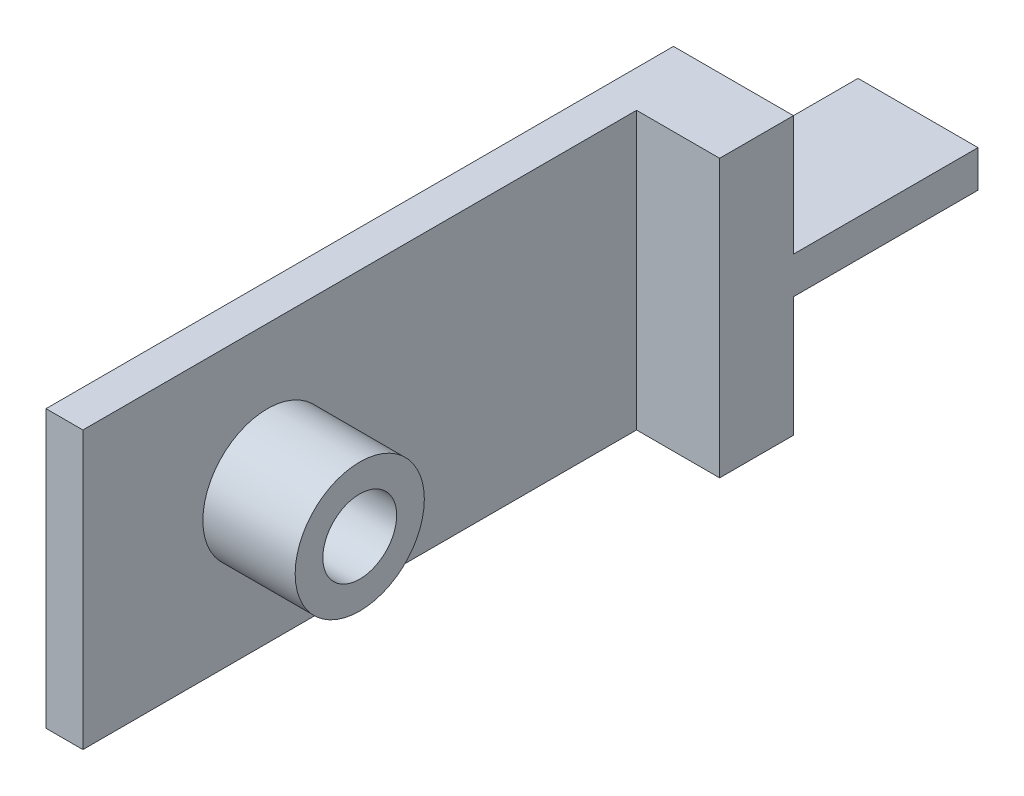
ISO-10303-21;
HEADER;
FILE_DESCRIPTION(('STEP AP214'),'2;1');
FILE_NAME('part.step','',(''),(''),'','','');
FILE_SCHEMA(('AUTOMOTIVE_DESIGN { 1 0 10303 214 1 1 1 1 }'));
ENDSEC;
DATA;
#1=APPLICATION_CONTEXT('core data for automotive mechanical design processes');
#2=APPLICATION_PROTOCOL_DEFINITION('international standard','automotive_design',2000,#1);
#3=PRODUCT_CONTEXT('',#1,'mechanical');
#4=PRODUCT('Part','Part','',(#3));
#5=PRODUCT_RELATED_PRODUCT_CATEGORY('part','',(#4));
#6=PRODUCT_DEFINITION_FORMATION('','',#4);
#7=PRODUCT_DEFINITION_CONTEXT('part definition',#1,'design');
#8=PRODUCT_DEFINITION('design','',#6,#7);
#9=PRODUCT_DEFINITION_SHAPE('','',#8);
#10=(LENGTH_UNIT() NAMED_UNIT(*) SI_UNIT(.MILLI.,.METRE.));
#11=(NAMED_UNIT(*) PLANE_ANGLE_UNIT() SI_UNIT($,.RADIAN.));
#12=(NAMED_UNIT(*) SI_UNIT($,.STERADIAN.) SOLID_ANGLE_UNIT());
#13=UNCERTAINTY_MEASURE_WITH_UNIT(LENGTH_MEASURE(1.E-05),#10,'distance_accuracy_value','');
#14=(GEOMETRIC_REPRESENTATION_CONTEXT(3) GLOBAL_UNCERTAINTY_ASSIGNED_CONTEXT((#13)) GLOBAL_UNIT_ASSIGNED_CONTEXT((#10,
#11,#12)) REPRESENTATION_CONTEXT('',''));
#15=CARTESIAN_POINT('',(0.,0.,0.));
#16=DIRECTION('',(0.,0.,1.));
#17=DIRECTION('',(1.,0.,0.));
#18=AXIS2_PLACEMENT_3D('',#15,#16,#17);
#19=CARTESIAN_POINT('',(0.,0.,-34.));
#20=DIRECTION('',(0.,0.,1.));
#21=DIRECTION('',(1.,0.,0.));
#22=AXIS2_PLACEMENT_3D('',#19,#20,#21);
#23=PLANE('',#22);
#24=DIRECTION('',(1.,0.,0.));
#25=VECTOR('',#24,1.);
#26=CARTESIAN_POINT('',(6.5,8.5,-34.));
#27=LINE('',#26,#25);
#28=CARTESIAN_POINT('',(0.,8.5,-34.));
#29=VERTEX_POINT('',#28);
#30=CARTESIAN_POINT('',(6.5,8.5,-34.));
#31=VERTEX_POINT('',#30);
#32=EDGE_CURVE('E128',#29,#31,#27,.T.);
#33=ORIENTED_EDGE('',*,*,#32,.F.);
#34=DIRECTION('',(0.,1.,0.));
#35=VECTOR('',#34,1.);
#36=CARTESIAN_POINT('',(0.,15.,-34.));
#37=LINE('',#36,#35);
#38=CARTESIAN_POINT('',(0.,15.,-34.));
#39=VERTEX_POINT('',#38);
#40=EDGE_CURVE('E144',#29,#39,#37,.T.);
#41=ORIENTED_EDGE('',*,*,#40,.T.);
#42=DIRECTION('',(1.,0.,0.));
#43=VECTOR('',#42,1.);
#44=CARTESIAN_POINT('',(0.,15.,-34.));
#45=LINE('',#44,#43);
#46=CARTESIAN_POINT('',(6.5,15.,-34.));
#47=VERTEX_POINT('',#46);
#48=EDGE_CURVE('E143',#39,#47,#45,.T.);
#49=ORIENTED_EDGE('',*,*,#48,.T.);
#50=DIRECTION('',(0.,-1.,0.));
#51=VECTOR('',#50,1.);
#52=CARTESIAN_POINT('',(6.5,15.,-34.));
#53=LINE('',#52,#51);
#54=EDGE_CURVE('E55',#47,#31,#53,.T.);
#55=ORIENTED_EDGE('',*,*,#54,.T.);
#56=EDGE_LOOP('',(#33,#41,#49,#55));
#57=FACE_BOUND('',#56,.T.);
#58=ADVANCED_FACE('F32',(#57),#23,.F.);
#59=DIRECTION('',(-1.,0.,0.));
#60=VECTOR('',#59,1.);
#61=CARTESIAN_POINT('',(6.5,6.5,-34.));
#62=LINE('',#61,#60);
#63=CARTESIAN_POINT('',(6.5,6.5,-34.));
#64=VERTEX_POINT('',#63);
#65=CARTESIAN_POINT('',(0.,6.5,-34.));
#66=VERTEX_POINT('',#65);
#67=EDGE_CURVE('E47',#64,#66,#62,.T.);
#68=ORIENTED_EDGE('',*,*,#67,.F.);
#69=CARTESIAN_POINT('',(6.5,0.,-34.));
#70=VERTEX_POINT('',#69);
#71=EDGE_CURVE('E132',#64,#70,#53,.T.);
#72=ORIENTED_EDGE('',*,*,#71,.T.);
#73=DIRECTION('',(-1.,0.,0.));
#74=VECTOR('',#73,1.);
#75=CARTESIAN_POINT('',(0.,0.,-34.));
#76=LINE('',#75,#74);
#77=CARTESIAN_POINT('',(0.,0.,-34.));
#78=VERTEX_POINT('',#77);
#79=EDGE_CURVE('E147',#70,#78,#76,.T.);
#80=ORIENTED_EDGE('',*,*,#79,.T.);
#81=EDGE_CURVE('E141',#78,#66,#37,.T.);
#82=ORIENTED_EDGE('',*,*,#81,.T.);
#83=EDGE_LOOP('',(#68,#72,#80,#82));
#84=FACE_BOUND('',#83,.T.);
#85=ADVANCED_FACE('F228',(#84),#23,.F.);
#86=CARTESIAN_POINT('',(2.,0.,0.));
#87=DIRECTION('',(0.,0.,-1.));
#88=DIRECTION('',(-1.,0.,0.));
#89=AXIS2_PLACEMENT_3D('',#86,#87,#88);
#90=PLANE('',#89);
#91=DIRECTION('',(0.,-1.,0.));
#92=VECTOR('',#91,1.);
#93=CARTESIAN_POINT('',(0.,0.,0.));
#94=LINE('',#93,#92);
#95=CARTESIAN_POINT('',(0.,15.,0.));
#96=VERTEX_POINT('',#95);
#97=CARTESIAN_POINT('',(0.,0.,0.));
#98=VERTEX_POINT('',#97);
#99=EDGE_CURVE('E160',#96,#98,#94,.T.);
#100=ORIENTED_EDGE('',*,*,#99,.T.);
#101=DIRECTION('',(-1.,0.,0.));
#102=VECTOR('',#101,1.);
#103=CARTESIAN_POINT('',(2.,0.,0.));
#104=LINE('',#103,#102);
#105=CARTESIAN_POINT('',(2.,0.,0.));
#106=VERTEX_POINT('',#105);
#107=EDGE_CURVE('E40',#106,#98,#104,.T.);
#108=ORIENTED_EDGE('',*,*,#107,.F.);
#109=DIRECTION('',(0.,-1.,0.));
#110=VECTOR('',#109,1.);
#111=CARTESIAN_POINT('',(2.,0.,0.));
#112=LINE('',#111,#110);
#113=CARTESIAN_POINT('',(2.,15.,0.));
#114=VERTEX_POINT('',#113);
#115=EDGE_CURVE('E161',#114,#106,#112,.T.);
#116=ORIENTED_EDGE('',*,*,#115,.F.);
#117=DIRECTION('',(-1.,0.,0.));
#118=VECTOR('',#117,1.);
#119=CARTESIAN_POINT('',(2.,15.,0.));
#120=LINE('',#119,#118);
#121=EDGE_CURVE('E173',#114,#96,#120,.T.);
#122=ORIENTED_EDGE('',*,*,#121,.T.);
#123=EDGE_LOOP('',(#100,#108,#116,#122));
#124=FACE_BOUND('',#123,.T.);
#125=ADVANCED_FACE('F34',(#124),#90,.F.);
#126=CARTESIAN_POINT('',(2.,0.,0.));
#127=DIRECTION('',(0.,1.,0.));
#128=DIRECTION('',(0.,0.,1.));
#129=AXIS2_PLACEMENT_3D('',#126,#127,#128);
#130=PLANE('',#129);
#131=DIRECTION('',(0.,0.,-1.));
#132=VECTOR('',#131,1.);
#133=CARTESIAN_POINT('',(0.,0.,0.));
#134=LINE('',#133,#132);
#135=EDGE_CURVE('E176',#98,#78,#134,.T.);
#136=ORIENTED_EDGE('',*,*,#135,.T.);
#137=ORIENTED_EDGE('',*,*,#79,.F.);
#138=DIRECTION('',(0.,0.,1.));
#139=VECTOR('',#138,1.);
#140=CARTESIAN_POINT('',(6.5,0.,-34.));
#141=LINE('',#140,#139);
#142=CARTESIAN_POINT('',(6.5,0.,-30.));
#143=VERTEX_POINT('',#142);
#144=EDGE_CURVE('E149',#70,#143,#141,.T.);
#145=ORIENTED_EDGE('',*,*,#144,.T.);
#146=DIRECTION('',(-1.,0.,0.));
#147=VECTOR('',#146,1.);
#148=CARTESIAN_POINT('',(0.,0.,-30.));
#149=LINE('',#148,#147);
#150=CARTESIAN_POINT('',(2.,0.,-30.));
#151=VERTEX_POINT('',#150);
#152=EDGE_CURVE('E152',#143,#151,#149,.T.);
#153=ORIENTED_EDGE('',*,*,#152,.T.);
#154=DIRECTION('',(0.,0.,-1.));
#155=VECTOR('',#154,1.);
#156=CARTESIAN_POINT('',(2.,0.,0.));
#157=LINE('',#156,#155);
#158=EDGE_CURVE('E164',#106,#151,#157,.T.);
#159=ORIENTED_EDGE('',*,*,#158,.F.);
#160=ORIENTED_EDGE('',*,*,#107,.T.);
#161=EDGE_LOOP('',(#136,#137,#145,#153,#159,#160));
#162=FACE_BOUND('',#161,.T.);
#163=ADVANCED_FACE('F219',(#162),#130,.F.);
#164=CARTESIAN_POINT('',(2.,15.,0.));
#165=DIRECTION('',(0.,-1.,0.));
#166=DIRECTION('',(0.,0.,-1.));
#167=AXIS2_PLACEMENT_3D('',#164,#165,#166);
#168=PLANE('',#167);
#169=DIRECTION('',(0.,0.,1.));
#170=VECTOR('',#169,1.);
#171=CARTESIAN_POINT('',(0.,15.,0.));
#172=LINE('',#171,#170);
#173=EDGE_CURVE('E165',#39,#96,#172,.T.);
#174=ORIENTED_EDGE('',*,*,#173,.T.);
#175=ORIENTED_EDGE('',*,*,#121,.F.);
#176=DIRECTION('',(0.,0.,1.));
#177=VECTOR('',#176,1.);
#178=CARTESIAN_POINT('',(2.,15.,0.));
#179=LINE('',#178,#177);
#180=CARTESIAN_POINT('',(2.,15.,-30.));
#181=VERTEX_POINT('',#180);
#182=EDGE_CURVE('E171',#181,#114,#179,.T.);
#183=ORIENTED_EDGE('',*,*,#182,.F.);
#184=DIRECTION('',(1.,0.,0.));
#185=VECTOR('',#184,1.);
#186=CARTESIAN_POINT('',(0.,15.,-30.));
#187=LINE('',#186,#185);
#188=CARTESIAN_POINT('',(6.5,15.,-30.));
#189=VERTEX_POINT('',#188);
#190=EDGE_CURVE('E133',#181,#189,#187,.T.);
#191=ORIENTED_EDGE('',*,*,#190,.T.);
#192=DIRECTION('',(0.,0.,1.));
#193=VECTOR('',#192,1.);
#194=CARTESIAN_POINT('',(6.5,15.,-34.));
#195=LINE('',#194,#193);
#196=EDGE_CURVE('E157',#47,#189,#195,.T.);
#197=ORIENTED_EDGE('',*,*,#196,.F.);
#198=ORIENTED_EDGE('',*,*,#48,.F.);
#199=EDGE_LOOP('',(#174,#175,#183,#191,#197,#198));
#200=FACE_BOUND('',#199,.T.);
#201=ADVANCED_FACE('F212',(#200),#168,.F.);
#202=CARTESIAN_POINT('',(2.,0.,0.));
#203=DIRECTION('',(-1.,0.,0.));
#204=DIRECTION('',(0.,0.,1.));
#205=AXIS2_PLACEMENT_3D('',#202,#203,#204);
#206=PLANE('',#205);
#207=CARTESIAN_POINT('',(2.,7.5,-10.));
#208=DIRECTION('',(-1.,0.,0.));
#209=DIRECTION('',(0.,0.,1.));
#210=AXIS2_PLACEMENT_3D('',#207,#208,#209);
#211=CIRCLE('',#210,3.5);
#212=CARTESIAN_POINT('',(2.,7.5,-6.5));
#213=VERTEX_POINT('',#212);
#214=EDGE_CURVE('E11',#213,#213,#211,.F.);
#215=ORIENTED_EDGE('',*,*,#214,.F.);
#216=EDGE_LOOP('',(#215));
#217=FACE_BOUND('',#216,.T.);
#218=ORIENTED_EDGE('',*,*,#115,.T.);
#219=ORIENTED_EDGE('',*,*,#158,.T.);
#220=DIRECTION('',(0.,1.,0.));
#221=VECTOR('',#220,1.);
#222=CARTESIAN_POINT('',(2.,0.,-30.));
#223=LINE('',#222,#221);
#224=EDGE_CURVE('E168',#151,#181,#223,.T.);
#225=ORIENTED_EDGE('',*,*,#224,.T.);
#226=ORIENTED_EDGE('',*,*,#182,.T.);
#227=EDGE_LOOP('',(#218,#219,#225,#226));
#228=FACE_BOUND('',#227,.T.);
#229=ADVANCED_FACE('F222',(#217,#228),#206,.F.);
#230=CARTESIAN_POINT('',(0.,0.,0.));
#231=DIRECTION('',(-1.,0.,0.));
#232=DIRECTION('',(0.,0.,1.));
#233=AXIS2_PLACEMENT_3D('',#230,#231,#232);
#234=PLANE('',#233);
#235=CARTESIAN_POINT('',(0.,7.5,-10.));
#236=DIRECTION('',(-1.,0.,0.));
#237=DIRECTION('',(0.,0.,1.));
#238=AXIS2_PLACEMENT_3D('',#235,#236,#237);
#239=CIRCLE('',#238,2.);
#240=CARTESIAN_POINT('',(0.,7.5,-8.));
#241=VERTEX_POINT('',#240);
#242=EDGE_CURVE('E182',#241,#241,#239,.T.);
#243=ORIENTED_EDGE('',*,*,#242,.F.);
#244=EDGE_LOOP('',(#243));
#245=FACE_BOUND('',#244,.T.);
#246=ORIENTED_EDGE('',*,*,#99,.F.);
#247=ORIENTED_EDGE('',*,*,#173,.F.);
#248=ORIENTED_EDGE('',*,*,#40,.F.);
#249=DIRECTION('',(0.,0.,1.));
#250=VECTOR('',#249,1.);
#251=CARTESIAN_POINT('',(0.,8.5,-44.));
#252=LINE('',#251,#250);
#253=CARTESIAN_POINT('',(0.,8.5,-44.));
#254=VERTEX_POINT('',#253);
#255=EDGE_CURVE('E137',#254,#29,#252,.T.);
#256=ORIENTED_EDGE('',*,*,#255,.F.);
#257=DIRECTION('',(0.,1.,0.));
#258=VECTOR('',#257,1.);
#259=CARTESIAN_POINT('',(0.,8.5,-44.));
#260=LINE('',#259,#258);
#261=CARTESIAN_POINT('',(0.,6.5,-44.));
#262=VERTEX_POINT('',#261);
#263=EDGE_CURVE('E118',#262,#254,#260,.T.);
#264=ORIENTED_EDGE('',*,*,#263,.F.);
#265=DIRECTION('',(0.,0.,1.));
#266=VECTOR('',#265,1.);
#267=CARTESIAN_POINT('',(0.,6.5,-44.));
#268=LINE('',#267,#266);
#269=EDGE_CURVE('E115',#262,#66,#268,.T.);
#270=ORIENTED_EDGE('',*,*,#269,.T.);
#271=ORIENTED_EDGE('',*,*,#81,.F.);
#272=ORIENTED_EDGE('',*,*,#135,.F.);
#273=EDGE_LOOP('',(#246,#247,#248,#256,#264,#270,#271,#272));
#274=FACE_BOUND('',#273,.T.);
#275=ADVANCED_FACE('F207',(#245,#274),#234,.T.);
#276=CARTESIAN_POINT('',(0.,0.,-30.));
#277=DIRECTION('',(0.,0.,1.));
#278=DIRECTION('',(1.,0.,0.));
#279=AXIS2_PLACEMENT_3D('',#276,#277,#278);
#280=PLANE('',#279);
#281=ORIENTED_EDGE('',*,*,#224,.F.);
#282=ORIENTED_EDGE('',*,*,#152,.F.);
#283=DIRECTION('',(0.,-1.,0.));
#284=VECTOR('',#283,1.);
#285=CARTESIAN_POINT('',(6.5,15.,-30.));
#286=LINE('',#285,#284);
#287=EDGE_CURVE('E135',#189,#143,#286,.T.);
#288=ORIENTED_EDGE('',*,*,#287,.F.);
#289=ORIENTED_EDGE('',*,*,#190,.F.);
#290=EDGE_LOOP('',(#281,#282,#288,#289));
#291=FACE_BOUND('',#290,.T.);
#292=ADVANCED_FACE('F217',(#291),#280,.T.);
#293=CARTESIAN_POINT('',(6.5,15.,-34.));
#294=DIRECTION('',(-1.,0.,0.));
#295=DIRECTION('',(0.,-1.,0.));
#296=AXIS2_PLACEMENT_3D('',#293,#294,#295);
#297=PLANE('',#296);
#298=ORIENTED_EDGE('',*,*,#287,.T.);
#299=ORIENTED_EDGE('',*,*,#144,.F.);
#300=ORIENTED_EDGE('',*,*,#71,.F.);
#301=DIRECTION('',(0.,0.,1.));
#302=VECTOR('',#301,1.);
#303=CARTESIAN_POINT('',(6.5,6.5,-44.));
#304=LINE('',#303,#302);
#305=CARTESIAN_POINT('',(6.5,6.5,-44.));
#306=VERTEX_POINT('',#305);
#307=EDGE_CURVE('E113',#306,#64,#304,.T.);
#308=ORIENTED_EDGE('',*,*,#307,.F.);
#309=DIRECTION('',(0.,-1.,0.));
#310=VECTOR('',#309,1.);
#311=CARTESIAN_POINT('',(6.5,8.5,-44.));
#312=LINE('',#311,#310);
#313=CARTESIAN_POINT('',(6.5,8.5,-44.));
#314=VERTEX_POINT('',#313);
#315=EDGE_CURVE('E119',#314,#306,#312,.T.);
#316=ORIENTED_EDGE('',*,*,#315,.F.);
#317=DIRECTION('',(0.,0.,1.));
#318=VECTOR('',#317,1.);
#319=CARTESIAN_POINT('',(6.5,8.5,-44.));
#320=LINE('',#319,#318);
#321=EDGE_CURVE('E197',#314,#31,#320,.T.);
#322=ORIENTED_EDGE('',*,*,#321,.T.);
#323=ORIENTED_EDGE('',*,*,#54,.F.);
#324=ORIENTED_EDGE('',*,*,#196,.T.);
#325=EDGE_LOOP('',(#298,#299,#300,#308,#316,#322,#323,#324));
#326=FACE_BOUND('',#325,.T.);
#327=ADVANCED_FACE('F130',(#326),#297,.F.);
#328=CARTESIAN_POINT('',(6.5,6.5,-44.));
#329=DIRECTION('',(0.,1.,0.));
#330=DIRECTION('',(0.,0.,1.));
#331=AXIS2_PLACEMENT_3D('',#328,#329,#330);
#332=PLANE('',#331);
#333=ORIENTED_EDGE('',*,*,#67,.T.);
#334=ORIENTED_EDGE('',*,*,#269,.F.);
#335=DIRECTION('',(-1.,0.,0.));
#336=VECTOR('',#335,1.);
#337=CARTESIAN_POINT('',(6.5,6.5,-44.));
#338=LINE('',#337,#336);
#339=EDGE_CURVE('E109',#306,#262,#338,.T.);
#340=ORIENTED_EDGE('',*,*,#339,.F.);
#341=ORIENTED_EDGE('',*,*,#307,.T.);
#342=EDGE_LOOP('',(#333,#334,#340,#341));
#343=FACE_BOUND('',#342,.T.);
#344=ADVANCED_FACE('F111',(#343),#332,.F.);
#345=CARTESIAN_POINT('',(6.5,8.5,-44.));
#346=DIRECTION('',(0.,-1.,0.));
#347=DIRECTION('',(1.,0.,0.));
#348=AXIS2_PLACEMENT_3D('',#345,#346,#347);
#349=PLANE('',#348);
#350=ORIENTED_EDGE('',*,*,#32,.T.);
#351=ORIENTED_EDGE('',*,*,#321,.F.);
#352=DIRECTION('',(1.,0.,0.));
#353=VECTOR('',#352,1.);
#354=CARTESIAN_POINT('',(6.5,8.5,-44.));
#355=LINE('',#354,#353);
#356=EDGE_CURVE('E124',#254,#314,#355,.T.);
#357=ORIENTED_EDGE('',*,*,#356,.F.);
#358=ORIENTED_EDGE('',*,*,#255,.T.);
#359=EDGE_LOOP('',(#350,#351,#357,#358));
#360=FACE_BOUND('',#359,.T.);
#361=ADVANCED_FACE('F203',(#360),#349,.F.);
#362=CARTESIAN_POINT('',(0.,0.,-44.));
#363=DIRECTION('',(0.,0.,-1.));
#364=DIRECTION('',(-1.,0.,0.));
#365=AXIS2_PLACEMENT_3D('',#362,#363,#364);
#366=PLANE('',#365);
#367=ORIENTED_EDGE('',*,*,#315,.T.);
#368=ORIENTED_EDGE('',*,*,#339,.T.);
#369=ORIENTED_EDGE('',*,*,#263,.T.);
#370=ORIENTED_EDGE('',*,*,#356,.T.);
#371=EDGE_LOOP('',(#367,#368,#369,#370));
#372=FACE_BOUND('',#371,.T.);
#373=ADVANCED_FACE('F122',(#372),#366,.T.);
#374=CARTESIAN_POINT('',(-3.,7.5,-10.));
#375=DIRECTION('',(1.,0.,0.));
#376=DIRECTION('',(0.,0.,-1.));
#377=AXIS2_PLACEMENT_3D('',#374,#375,#376);
#378=CYLINDRICAL_SURFACE('',#377,2.);
#379=ORIENTED_EDGE('',*,*,#242,.T.);
#380=EDGE_LOOP('',(#379));
#381=FACE_BOUND('',#380,.T.);
#382=CARTESIAN_POINT('',(7.,7.5,-10.));
#383=DIRECTION('',(1.,0.,0.));
#384=DIRECTION('',(0.,0.,-1.));
#385=AXIS2_PLACEMENT_3D('',#382,#383,#384);
#386=CIRCLE('',#385,2.);
#387=CARTESIAN_POINT('',(7.,7.5,-12.));
#388=VERTEX_POINT('',#387);
#389=EDGE_CURVE('E189',#388,#388,#386,.F.);
#390=ORIENTED_EDGE('',*,*,#389,.F.);
#391=EDGE_LOOP('',(#390));
#392=FACE_BOUND('',#391,.T.);
#393=ADVANCED_FACE('F292',(#381,#392),#378,.F.);
#394=CARTESIAN_POINT('',(7.,7.5,-10.));
#395=DIRECTION('',(-1.,0.,0.));
#396=DIRECTION('',(0.,0.,1.));
#397=AXIS2_PLACEMENT_3D('',#394,#395,#396);
#398=CYLINDRICAL_SURFACE('',#397,3.5);
#399=CARTESIAN_POINT('',(7.,7.5,-10.));
#400=DIRECTION('',(1.,0.,0.));
#401=DIRECTION('',(0.,0.,-1.));
#402=AXIS2_PLACEMENT_3D('',#399,#400,#401);
#403=CIRCLE('',#402,3.5);
#404=CARTESIAN_POINT('',(7.,7.5,-13.5));
#405=VERTEX_POINT('',#404);
#406=EDGE_CURVE('E184',#405,#405,#403,.T.);
#407=ORIENTED_EDGE('',*,*,#406,.F.);
#408=EDGE_LOOP('',(#407));
#409=FACE_BOUND('',#408,.T.);
#410=ORIENTED_EDGE('',*,*,#214,.T.);
#411=EDGE_LOOP('',(#410));
#412=FACE_BOUND('',#411,.T.);
#413=ADVANCED_FACE('F298',(#409,#412),#398,.T.);
#414=CARTESIAN_POINT('',(7.,0.,0.));
#415=DIRECTION('',(1.,0.,0.));
#416=DIRECTION('',(0.,0.,-1.));
#417=AXIS2_PLACEMENT_3D('',#414,#415,#416);
#418=PLANE('',#417);
#419=ORIENTED_EDGE('',*,*,#389,.T.);
#420=EDGE_LOOP('',(#419));
#421=FACE_BOUND('',#420,.T.);
#422=ORIENTED_EDGE('',*,*,#406,.T.);
#423=EDGE_LOOP('',(#422));
#424=FACE_BOUND('',#423,.T.);
#425=ADVANCED_FACE('F305',(#421,#424),#418,.T.);
#426=CLOSED_SHELL('',(#58,#85,#125,#163,#201,#229,#275,#292,#327,#344,#361,#373,#393,#413,#425));
#427=MANIFOLD_SOLID_BREP('B2',#426);
#428=ADVANCED_BREP_SHAPE_REPRESENTATION('',(#18,#427),#14);
#429=SHAPE_DEFINITION_REPRESENTATION(#9,#428);
ENDSEC;
END-ISO-10303-21;
